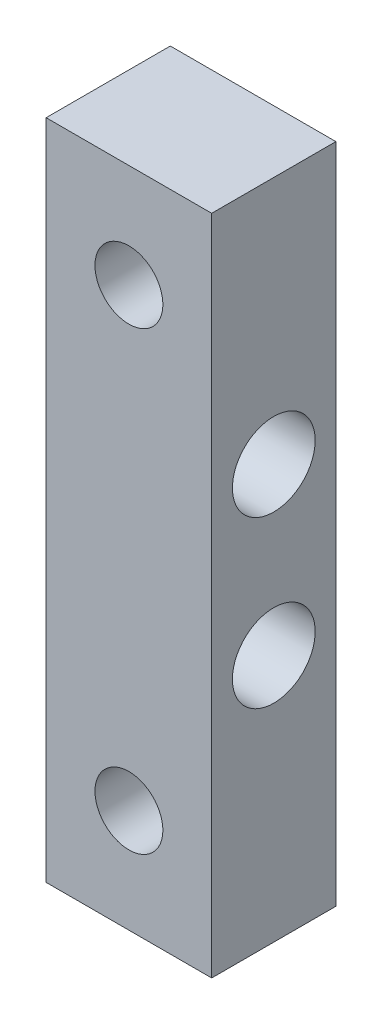
ISO-10303-21;
HEADER;
FILE_DESCRIPTION(('STEP AP214'),'2;1');
FILE_NAME('part.step','',(''),(''),'','','');
FILE_SCHEMA(('AUTOMOTIVE_DESIGN { 1 0 10303 214 1 1 1 1 }'));
ENDSEC;
DATA;
#1=APPLICATION_CONTEXT('core data for automotive mechanical design processes');
#2=APPLICATION_PROTOCOL_DEFINITION('international standard','automotive_design',2000,#1);
#3=PRODUCT_CONTEXT('',#1,'mechanical');
#4=PRODUCT('Part','Part','',(#3));
#5=PRODUCT_RELATED_PRODUCT_CATEGORY('part','',(#4));
#6=PRODUCT_DEFINITION_FORMATION('','',#4);
#7=PRODUCT_DEFINITION_CONTEXT('part definition',#1,'design');
#8=PRODUCT_DEFINITION('design','',#6,#7);
#9=PRODUCT_DEFINITION_SHAPE('','',#8);
#10=(LENGTH_UNIT() NAMED_UNIT(*) SI_UNIT(.MILLI.,.METRE.));
#11=(NAMED_UNIT(*) PLANE_ANGLE_UNIT() SI_UNIT($,.RADIAN.));
#12=(NAMED_UNIT(*) SI_UNIT($,.STERADIAN.) SOLID_ANGLE_UNIT());
#13=UNCERTAINTY_MEASURE_WITH_UNIT(LENGTH_MEASURE(1.E-05),#10,'distance_accuracy_value','');
#14=(GEOMETRIC_REPRESENTATION_CONTEXT(3) GLOBAL_UNCERTAINTY_ASSIGNED_CONTEXT((#13)) GLOBAL_UNIT_ASSIGNED_CONTEXT((#10,
#11,#12)) REPRESENTATION_CONTEXT('',''));
#15=CARTESIAN_POINT('',(0.,0.,0.));
#16=DIRECTION('',(0.,0.,1.));
#17=DIRECTION('',(1.,0.,0.));
#18=AXIS2_PLACEMENT_3D('',#15,#16,#17);
#19=CARTESIAN_POINT('',(50.7999999999868,0.,0.));
#20=DIRECTION('',(1.,0.,0.));
#21=DIRECTION('',(0.,0.,-1.));
#22=AXIS2_PLACEMENT_3D('',#19,#20,#21);
#23=PLANE('',#22);
#24=CARTESIAN_POINT('',(50.7999999999868,769.106140975981,134.9375));
#25=DIRECTION('',(1.,0.,0.));
#26=DIRECTION('',(0.,0.,-1.));
#27=AXIS2_PLACEMENT_3D('',#24,#25,#26);
#28=CIRCLE('',#27,3.175);
#29=CARTESIAN_POINT('',(50.7999999999868,769.106140975981,131.7625));
#30=VERTEX_POINT('',#29);
#31=EDGE_CURVE('E100',#30,#30,#28,.T.);
#32=ORIENTED_EDGE('',*,*,#31,.F.);
#33=EDGE_LOOP('',(#32));
#34=FACE_BOUND('',#33,.T.);
#35=DIRECTION('',(0.,-1.,0.));
#36=VECTOR('',#35,1.);
#37=CARTESIAN_POINT('',(50.7999999999868,788.156140975981,139.7));
#38=LINE('',#37,#36);
#39=CARTESIAN_POINT('',(50.7999999999868,788.156140975981,139.7));
#40=VERTEX_POINT('',#39);
#41=CARTESIAN_POINT('',(50.7999999999868,737.356140975981,139.7));
#42=VERTEX_POINT('',#41);
#43=EDGE_CURVE('E85',#40,#42,#38,.T.);
#44=ORIENTED_EDGE('',*,*,#43,.T.);
#45=DIRECTION('',(0.,0.,-1.));
#46=VECTOR('',#45,1.);
#47=CARTESIAN_POINT('',(50.7999999999868,737.356140975981,139.7));
#48=LINE('',#47,#46);
#49=CARTESIAN_POINT('',(50.7999999999868,737.356140975981,130.175));
#50=VERTEX_POINT('',#49);
#51=EDGE_CURVE('E80',#42,#50,#48,.T.);
#52=ORIENTED_EDGE('',*,*,#51,.T.);
#53=DIRECTION('',(0.,1.,0.));
#54=VECTOR('',#53,1.);
#55=CARTESIAN_POINT('',(50.7999999999868,788.156140975981,130.175));
#56=LINE('',#55,#54);
#57=CARTESIAN_POINT('',(50.7999999999868,788.156140975981,130.175));
#58=VERTEX_POINT('',#57);
#59=EDGE_CURVE('E83',#50,#58,#56,.T.);
#60=ORIENTED_EDGE('',*,*,#59,.T.);
#61=DIRECTION('',(0.,0.,1.));
#62=VECTOR('',#61,1.);
#63=CARTESIAN_POINT('',(50.7999999999868,788.156140975981,139.7));
#64=LINE('',#63,#62);
#65=EDGE_CURVE('E50',#58,#40,#64,.T.);
#66=ORIENTED_EDGE('',*,*,#65,.T.);
#67=EDGE_LOOP('',(#44,#52,#60,#66));
#68=FACE_BOUND('',#67,.T.);
#69=CARTESIAN_POINT('',(50.7999999999868,756.406140975981,134.9375));
#70=DIRECTION('',(1.,0.,0.));
#71=DIRECTION('',(0.,0.,1.));
#72=AXIS2_PLACEMENT_3D('',#69,#70,#71);
#73=CIRCLE('',#72,3.175);
#74=CARTESIAN_POINT('',(50.7999999999868,756.406140975981,138.1125));
#75=VERTEX_POINT('',#74);
#76=EDGE_CURVE('E115',#75,#75,#73,.T.);
#77=ORIENTED_EDGE('',*,*,#76,.F.);
#78=EDGE_LOOP('',(#77));
#79=FACE_BOUND('',#78,.T.);
#80=ADVANCED_FACE('F33',(#34,#68,#79),#23,.T.);
#81=CARTESIAN_POINT('',(38.0999999999868,0.,0.));
#82=DIRECTION('',(1.,0.,0.));
#83=DIRECTION('',(0.,0.,-1.));
#84=AXIS2_PLACEMENT_3D('',#81,#82,#83);
#85=PLANE('',#84);
#86=DIRECTION('',(0.,-1.,0.));
#87=VECTOR('',#86,1.);
#88=CARTESIAN_POINT('',(38.0999999999868,788.156140975981,139.7));
#89=LINE('',#88,#87);
#90=CARTESIAN_POINT('',(38.0999999999868,788.156140975981,139.7));
#91=VERTEX_POINT('',#90);
#92=CARTESIAN_POINT('',(38.0999999999868,737.356140975981,139.7));
#93=VERTEX_POINT('',#92);
#94=EDGE_CURVE('E97',#91,#93,#89,.T.);
#95=ORIENTED_EDGE('',*,*,#94,.F.);
#96=DIRECTION('',(0.,0.,1.));
#97=VECTOR('',#96,1.);
#98=CARTESIAN_POINT('',(38.0999999999868,788.156140975981,139.7));
#99=LINE('',#98,#97);
#100=CARTESIAN_POINT('',(38.0999999999868,788.156140975981,130.175));
#101=VERTEX_POINT('',#100);
#102=EDGE_CURVE('E73',#101,#91,#99,.T.);
#103=ORIENTED_EDGE('',*,*,#102,.F.);
#104=DIRECTION('',(0.,1.,0.));
#105=VECTOR('',#104,1.);
#106=CARTESIAN_POINT('',(38.0999999999868,788.156140975981,130.175));
#107=LINE('',#106,#105);
#108=CARTESIAN_POINT('',(38.0999999999868,737.356140975981,130.175));
#109=VERTEX_POINT('',#108);
#110=EDGE_CURVE('E67',#109,#101,#107,.T.);
#111=ORIENTED_EDGE('',*,*,#110,.F.);
#112=DIRECTION('',(0.,0.,-1.));
#113=VECTOR('',#112,1.);
#114=CARTESIAN_POINT('',(38.0999999999868,737.356140975981,139.7));
#115=LINE('',#114,#113);
#116=EDGE_CURVE('E89',#93,#109,#115,.T.);
#117=ORIENTED_EDGE('',*,*,#116,.F.);
#118=EDGE_LOOP('',(#95,#103,#111,#117));
#119=FACE_BOUND('',#118,.T.);
#120=CARTESIAN_POINT('',(38.0999999999868,769.106140975981,134.9375));
#121=DIRECTION('',(1.,0.,0.));
#122=DIRECTION('',(0.,0.,-1.));
#123=AXIS2_PLACEMENT_3D('',#120,#121,#122);
#124=CIRCLE('',#123,3.175);
#125=CARTESIAN_POINT('',(38.0999999999868,769.106140975981,131.7625));
#126=VERTEX_POINT('',#125);
#127=EDGE_CURVE('E112',#126,#126,#124,.T.);
#128=ORIENTED_EDGE('',*,*,#127,.T.);
#129=EDGE_LOOP('',(#128));
#130=FACE_BOUND('',#129,.T.);
#131=CARTESIAN_POINT('',(38.0999999999868,756.406140975981,134.9375));
#132=DIRECTION('',(1.,0.,0.));
#133=DIRECTION('',(0.,0.,1.));
#134=AXIS2_PLACEMENT_3D('',#131,#132,#133);
#135=CIRCLE('',#134,3.175);
#136=CARTESIAN_POINT('',(38.0999999999868,756.406140975981,138.1125));
#137=VERTEX_POINT('',#136);
#138=EDGE_CURVE('E118',#137,#137,#135,.T.);
#139=ORIENTED_EDGE('',*,*,#138,.T.);
#140=EDGE_LOOP('',(#139));
#141=FACE_BOUND('',#140,.T.);
#142=ADVANCED_FACE('F108',(#119,#130,#141),#85,.F.);
#143=CARTESIAN_POINT('',(50.7999999999868,788.156140975981,139.7));
#144=DIRECTION('',(0.,0.,-1.));
#145=DIRECTION('',(-1.,0.,0.));
#146=AXIS2_PLACEMENT_3D('',#143,#144,#145);
#147=PLANE('',#146);
#148=CARTESIAN_POINT('',(44.4499999999868,780.218640975981,139.7));
#149=DIRECTION('',(0.,0.,-1.));
#150=DIRECTION('',(-1.,0.,0.));
#151=AXIS2_PLACEMENT_3D('',#148,#149,#150);
#152=CIRCLE('',#151,2.60350000000001);
#153=CARTESIAN_POINT('',(41.8464999999867,780.218640975981,139.7));
#154=VERTEX_POINT('',#153);
#155=EDGE_CURVE('E121',#154,#154,#152,.F.);
#156=ORIENTED_EDGE('',*,*,#155,.F.);
#157=EDGE_LOOP('',(#156));
#158=FACE_BOUND('',#157,.T.);
#159=CARTESIAN_POINT('',(44.4499999999868,745.293640975981,139.7));
#160=DIRECTION('',(0.,0.,-1.));
#161=DIRECTION('',(-1.,0.,0.));
#162=AXIS2_PLACEMENT_3D('',#159,#160,#161);
#163=CIRCLE('',#162,2.60350000000001);
#164=CARTESIAN_POINT('',(41.8464999999867,745.293640975981,139.7));
#165=VERTEX_POINT('',#164);
#166=EDGE_CURVE('E124',#165,#165,#163,.F.);
#167=ORIENTED_EDGE('',*,*,#166,.F.);
#168=EDGE_LOOP('',(#167));
#169=FACE_BOUND('',#168,.T.);
#170=ORIENTED_EDGE('',*,*,#94,.T.);
#171=DIRECTION('',(-1.,0.,0.));
#172=VECTOR('',#171,1.);
#173=CARTESIAN_POINT('',(50.7999999999868,737.356140975981,139.7));
#174=LINE('',#173,#172);
#175=EDGE_CURVE('E11',#42,#93,#174,.T.);
#176=ORIENTED_EDGE('',*,*,#175,.F.);
#177=ORIENTED_EDGE('',*,*,#43,.F.);
#178=DIRECTION('',(-1.,0.,0.));
#179=VECTOR('',#178,1.);
#180=CARTESIAN_POINT('',(50.7999999999868,788.156140975981,139.7));
#181=LINE('',#180,#179);
#182=EDGE_CURVE('E93',#40,#91,#181,.T.);
#183=ORIENTED_EDGE('',*,*,#182,.T.);
#184=EDGE_LOOP('',(#170,#176,#177,#183));
#185=FACE_BOUND('',#184,.T.);
#186=ADVANCED_FACE('F35',(#158,#169,#185),#147,.F.);
#187=CARTESIAN_POINT('',(50.7999999999868,737.356140975981,139.7));
#188=DIRECTION('',(0.,1.,0.));
#189=DIRECTION('',(0.,0.,1.));
#190=AXIS2_PLACEMENT_3D('',#187,#188,#189);
#191=PLANE('',#190);
#192=ORIENTED_EDGE('',*,*,#116,.T.);
#193=DIRECTION('',(-1.,0.,0.));
#194=VECTOR('',#193,1.);
#195=CARTESIAN_POINT('',(50.7999999999868,737.356140975981,130.175));
#196=LINE('',#195,#194);
#197=EDGE_CURVE('E42',#50,#109,#196,.T.);
#198=ORIENTED_EDGE('',*,*,#197,.F.);
#199=ORIENTED_EDGE('',*,*,#51,.F.);
#200=ORIENTED_EDGE('',*,*,#175,.T.);
#201=EDGE_LOOP('',(#192,#198,#199,#200));
#202=FACE_BOUND('',#201,.T.);
#203=ADVANCED_FACE('F88',(#202),#191,.F.);
#204=CARTESIAN_POINT('',(50.7999999999868,788.156140975981,130.175));
#205=DIRECTION('',(0.,0.,1.));
#206=DIRECTION('',(0.,-1.,0.));
#207=AXIS2_PLACEMENT_3D('',#204,#205,#206);
#208=PLANE('',#207);
#209=CARTESIAN_POINT('',(44.4499999999868,780.218640975981,130.175));
#210=DIRECTION('',(0.,0.,-1.));
#211=DIRECTION('',(0.,1.,0.));
#212=AXIS2_PLACEMENT_3D('',#209,#210,#211);
#213=CIRCLE('',#212,2.60350000000001);
#214=CARTESIAN_POINT('',(44.4499999999868,782.82214097598,130.175));
#215=VERTEX_POINT('',#214);
#216=EDGE_CURVE('E127',#215,#215,#213,.T.);
#217=ORIENTED_EDGE('',*,*,#216,.F.);
#218=EDGE_LOOP('',(#217));
#219=FACE_BOUND('',#218,.T.);
#220=CARTESIAN_POINT('',(44.4499999999868,745.293640975981,130.175));
#221=DIRECTION('',(0.,0.,-1.));
#222=DIRECTION('',(0.,1.,0.));
#223=AXIS2_PLACEMENT_3D('',#220,#221,#222);
#224=CIRCLE('',#223,2.60350000000001);
#225=CARTESIAN_POINT('',(44.4499999999868,747.897140975981,130.175));
#226=VERTEX_POINT('',#225);
#227=EDGE_CURVE('E128',#226,#226,#224,.T.);
#228=ORIENTED_EDGE('',*,*,#227,.F.);
#229=EDGE_LOOP('',(#228));
#230=FACE_BOUND('',#229,.T.);
#231=ORIENTED_EDGE('',*,*,#110,.T.);
#232=DIRECTION('',(-1.,0.,0.));
#233=VECTOR('',#232,1.);
#234=CARTESIAN_POINT('',(50.7999999999868,788.156140975981,130.175));
#235=LINE('',#234,#233);
#236=EDGE_CURVE('E90',#58,#101,#235,.T.);
#237=ORIENTED_EDGE('',*,*,#236,.F.);
#238=ORIENTED_EDGE('',*,*,#59,.F.);
#239=ORIENTED_EDGE('',*,*,#197,.T.);
#240=EDGE_LOOP('',(#231,#237,#238,#239));
#241=FACE_BOUND('',#240,.T.);
#242=ADVANCED_FACE('F91',(#219,#230,#241),#208,.F.);
#243=CARTESIAN_POINT('',(50.7999999999868,788.156140975981,139.7));
#244=DIRECTION('',(0.,-1.,0.));
#245=DIRECTION('',(0.,0.,-1.));
#246=AXIS2_PLACEMENT_3D('',#243,#244,#245);
#247=PLANE('',#246);
#248=ORIENTED_EDGE('',*,*,#102,.T.);
#249=ORIENTED_EDGE('',*,*,#182,.F.);
#250=ORIENTED_EDGE('',*,*,#65,.F.);
#251=ORIENTED_EDGE('',*,*,#236,.T.);
#252=EDGE_LOOP('',(#248,#249,#250,#251));
#253=FACE_BOUND('',#252,.T.);
#254=ADVANCED_FACE('F105',(#253),#247,.F.);
#255=CARTESIAN_POINT('',(50.7999999999868,769.106140975981,134.9375));
#256=DIRECTION('',(-1.,0.,0.));
#257=DIRECTION('',(0.,0.,1.));
#258=AXIS2_PLACEMENT_3D('',#255,#256,#257);
#259=CYLINDRICAL_SURFACE('',#258,3.175);
#260=ORIENTED_EDGE('',*,*,#31,.T.);
#261=EDGE_LOOP('',(#260));
#262=FACE_BOUND('',#261,.T.);
#263=ORIENTED_EDGE('',*,*,#127,.F.);
#264=EDGE_LOOP('',(#263));
#265=FACE_BOUND('',#264,.T.);
#266=ADVANCED_FACE('F166',(#262,#265),#259,.F.);
#267=CARTESIAN_POINT('',(50.7999999999868,756.406140975981,134.9375));
#268=DIRECTION('',(-1.,0.,0.));
#269=DIRECTION('',(0.,0.,1.));
#270=AXIS2_PLACEMENT_3D('',#267,#268,#269);
#271=CYLINDRICAL_SURFACE('',#270,3.175);
#272=ORIENTED_EDGE('',*,*,#76,.T.);
#273=EDGE_LOOP('',(#272));
#274=FACE_BOUND('',#273,.T.);
#275=ORIENTED_EDGE('',*,*,#138,.F.);
#276=EDGE_LOOP('',(#275));
#277=FACE_BOUND('',#276,.T.);
#278=ADVANCED_FACE('F147',(#274,#277),#271,.F.);
#279=CARTESIAN_POINT('',(44.4499999999868,745.293640975981,139.701));
#280=DIRECTION('',(0.,0.,-1.));
#281=DIRECTION('',(0.,1.,0.));
#282=AXIS2_PLACEMENT_3D('',#279,#280,#281);
#283=CYLINDRICAL_SURFACE('',#282,2.60350000000001);
#284=ORIENTED_EDGE('',*,*,#227,.T.);
#285=EDGE_LOOP('',(#284));
#286=FACE_BOUND('',#285,.T.);
#287=ORIENTED_EDGE('',*,*,#166,.T.);
#288=EDGE_LOOP('',(#287));
#289=FACE_BOUND('',#288,.T.);
#290=ADVANCED_FACE('F144',(#286,#289),#283,.F.);
#291=CARTESIAN_POINT('',(44.4499999999868,780.218640975981,139.701));
#292=DIRECTION('',(0.,0.,-1.));
#293=DIRECTION('',(0.,1.,0.));
#294=AXIS2_PLACEMENT_3D('',#291,#292,#293);
#295=CYLINDRICAL_SURFACE('',#294,2.60350000000001);
#296=ORIENTED_EDGE('',*,*,#216,.T.);
#297=EDGE_LOOP('',(#296));
#298=FACE_BOUND('',#297,.T.);
#299=ORIENTED_EDGE('',*,*,#155,.T.);
#300=EDGE_LOOP('',(#299));
#301=FACE_BOUND('',#300,.T.);
#302=ADVANCED_FACE('F136',(#298,#301),#295,.F.);
#303=CLOSED_SHELL('',(#80,#142,#186,#203,#242,#254,#266,#278,#290,#302));
#304=MANIFOLD_SOLID_BREP('B2',#303);
#305=ADVANCED_BREP_SHAPE_REPRESENTATION('',(#18,#304),#14);
#306=SHAPE_DEFINITION_REPRESENTATION(#9,#305);
ENDSEC;
END-ISO-10303-21;
